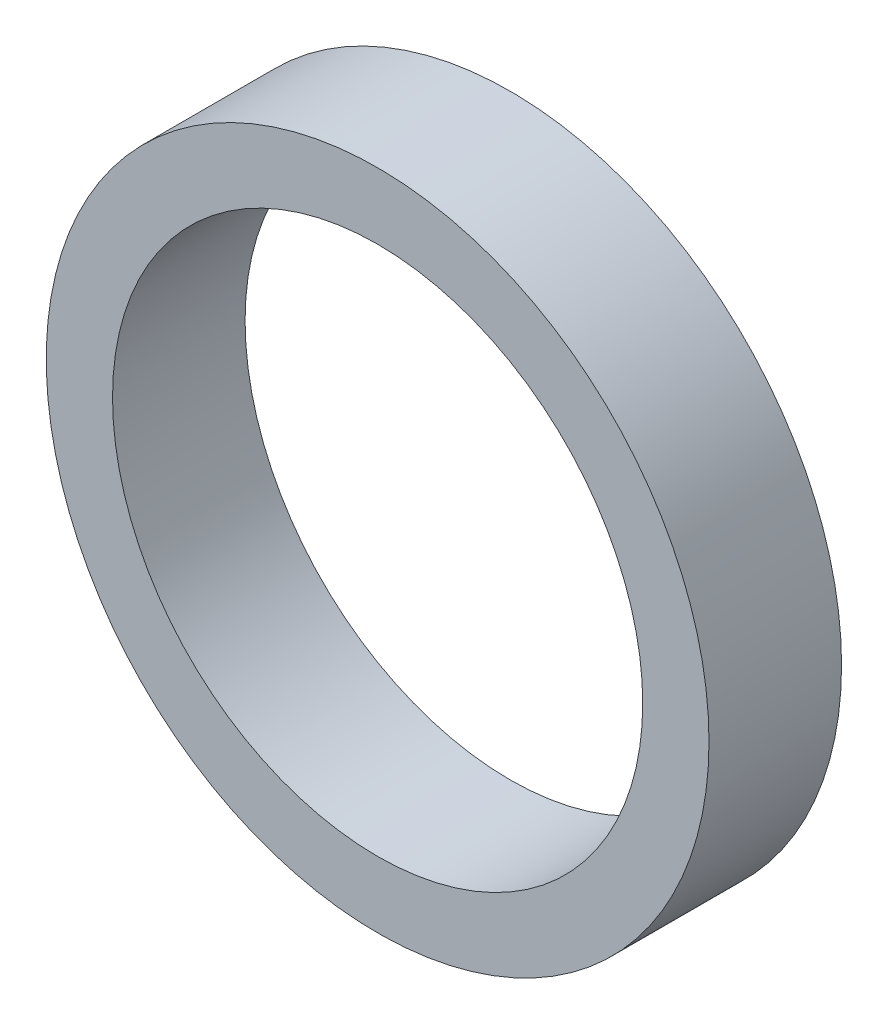
ISO-10303-21;
HEADER;
FILE_DESCRIPTION(('STEP AP214'),'2;1');
FILE_NAME('part.step','',(''),(''),'','','');
FILE_SCHEMA(('AUTOMOTIVE_DESIGN { 1 0 10303 214 1 1 1 1 }'));
ENDSEC;
DATA;
#1=APPLICATION_CONTEXT('core data for automotive mechanical design processes');
#2=APPLICATION_PROTOCOL_DEFINITION('international standard','automotive_design',2000,#1);
#3=PRODUCT_CONTEXT('',#1,'mechanical');
#4=PRODUCT('Part','Part','',(#3));
#5=PRODUCT_RELATED_PRODUCT_CATEGORY('part','',(#4));
#6=PRODUCT_DEFINITION_FORMATION('','',#4);
#7=PRODUCT_DEFINITION_CONTEXT('part definition',#1,'design');
#8=PRODUCT_DEFINITION('design','',#6,#7);
#9=PRODUCT_DEFINITION_SHAPE('','',#8);
#10=(LENGTH_UNIT() NAMED_UNIT(*) SI_UNIT(.MILLI.,.METRE.));
#11=(NAMED_UNIT(*) PLANE_ANGLE_UNIT() SI_UNIT($,.RADIAN.));
#12=(NAMED_UNIT(*) SI_UNIT($,.STERADIAN.) SOLID_ANGLE_UNIT());
#13=UNCERTAINTY_MEASURE_WITH_UNIT(LENGTH_MEASURE(1.E-05),#10,'distance_accuracy_value','');
#14=(GEOMETRIC_REPRESENTATION_CONTEXT(3) GLOBAL_UNCERTAINTY_ASSIGNED_CONTEXT((#13)) GLOBAL_UNIT_ASSIGNED_CONTEXT((#10,
#11,#12)) REPRESENTATION_CONTEXT('',''));
#15=CARTESIAN_POINT('',(0.,0.,0.));
#16=DIRECTION('',(0.,0.,1.));
#17=DIRECTION('',(1.,0.,0.));
#18=AXIS2_PLACEMENT_3D('',#15,#16,#17);
#19=CARTESIAN_POINT('',(0.,0.,2.5));
#20=DIRECTION('',(0.,0.,1.));
#21=DIRECTION('',(1.,0.,0.));
#22=AXIS2_PLACEMENT_3D('',#19,#20,#21);
#23=PLANE('',#22);
#24=CARTESIAN_POINT('',(0.,0.,2.5));
#25=DIRECTION('',(0.,0.,1.));
#26=DIRECTION('',(1.,0.,0.));
#27=AXIS2_PLACEMENT_3D('',#24,#25,#26);
#28=CIRCLE('',#27,12.5);
#29=CARTESIAN_POINT('',(12.5,0.,2.5));
#30=VERTEX_POINT('',#29);
#31=EDGE_CURVE('E10',#30,#30,#28,.T.);
#32=ORIENTED_EDGE('',*,*,#31,.T.);
#33=EDGE_LOOP('',(#32));
#34=FACE_BOUND('',#33,.T.);
#35=CARTESIAN_POINT('',(0.,0.,2.5));
#36=DIRECTION('',(0.,0.,1.));
#37=DIRECTION('',(1.,0.,0.));
#38=AXIS2_PLACEMENT_3D('',#35,#36,#37);
#39=CIRCLE('',#38,10.);
#40=CARTESIAN_POINT('',(10.,0.,2.5));
#41=VERTEX_POINT('',#40);
#42=EDGE_CURVE('E48',#41,#41,#39,.T.);
#43=ORIENTED_EDGE('',*,*,#42,.F.);
#44=EDGE_LOOP('',(#43));
#45=FACE_BOUND('',#44,.T.);
#46=ADVANCED_FACE('F37',(#34,#45),#23,.T.);
#47=CARTESIAN_POINT('',(0.,0.,-2.5));
#48=DIRECTION('',(0.,0.,1.));
#49=DIRECTION('',(1.,0.,0.));
#50=AXIS2_PLACEMENT_3D('',#47,#48,#49);
#51=PLANE('',#50);
#52=CARTESIAN_POINT('',(0.,0.,-2.5));
#53=DIRECTION('',(0.,0.,1.));
#54=DIRECTION('',(1.,0.,0.));
#55=AXIS2_PLACEMENT_3D('',#52,#53,#54);
#56=CIRCLE('',#55,12.5);
#57=CARTESIAN_POINT('',(12.5,0.,-2.5));
#58=VERTEX_POINT('',#57);
#59=EDGE_CURVE('E41',#58,#58,#56,.T.);
#60=ORIENTED_EDGE('',*,*,#59,.F.);
#61=EDGE_LOOP('',(#60));
#62=FACE_BOUND('',#61,.T.);
#63=CARTESIAN_POINT('',(0.,0.,-2.5));
#64=DIRECTION('',(0.,0.,1.));
#65=DIRECTION('',(1.,0.,0.));
#66=AXIS2_PLACEMENT_3D('',#63,#64,#65);
#67=CIRCLE('',#66,10.);
#68=CARTESIAN_POINT('',(10.,0.,-2.5));
#69=VERTEX_POINT('',#68);
#70=EDGE_CURVE('E50',#69,#69,#67,.T.);
#71=ORIENTED_EDGE('',*,*,#70,.T.);
#72=EDGE_LOOP('',(#71));
#73=FACE_BOUND('',#72,.T.);
#74=ADVANCED_FACE('F60',(#62,#73),#51,.F.);
#75=CARTESIAN_POINT('',(0.,0.,2.5));
#76=DIRECTION('',(0.,0.,-1.));
#77=DIRECTION('',(-1.,0.,0.));
#78=AXIS2_PLACEMENT_3D('',#75,#76,#77);
#79=CYLINDRICAL_SURFACE('',#78,12.5);
#80=ORIENTED_EDGE('',*,*,#31,.F.);
#81=EDGE_LOOP('',(#80));
#82=FACE_BOUND('',#81,.T.);
#83=ORIENTED_EDGE('',*,*,#59,.T.);
#84=EDGE_LOOP('',(#83));
#85=FACE_BOUND('',#84,.T.);
#86=ADVANCED_FACE('F39',(#82,#85),#79,.T.);
#87=CARTESIAN_POINT('',(0.,0.,2.5));
#88=DIRECTION('',(0.,0.,-1.));
#89=DIRECTION('',(-1.,0.,0.));
#90=AXIS2_PLACEMENT_3D('',#87,#88,#89);
#91=CYLINDRICAL_SURFACE('',#90,10.);
#92=ORIENTED_EDGE('',*,*,#42,.T.);
#93=EDGE_LOOP('',(#92));
#94=FACE_BOUND('',#93,.T.);
#95=ORIENTED_EDGE('',*,*,#70,.F.);
#96=EDGE_LOOP('',(#95));
#97=FACE_BOUND('',#96,.T.);
#98=ADVANCED_FACE('F56',(#94,#97),#91,.F.);
#99=CLOSED_SHELL('',(#46,#74,#86,#98));
#100=MANIFOLD_SOLID_BREP('B2',#99);
#101=ADVANCED_BREP_SHAPE_REPRESENTATION('',(#18,#100),#14);
#102=SHAPE_DEFINITION_REPRESENTATION(#9,#101);
ENDSEC;
END-ISO-10303-21;
